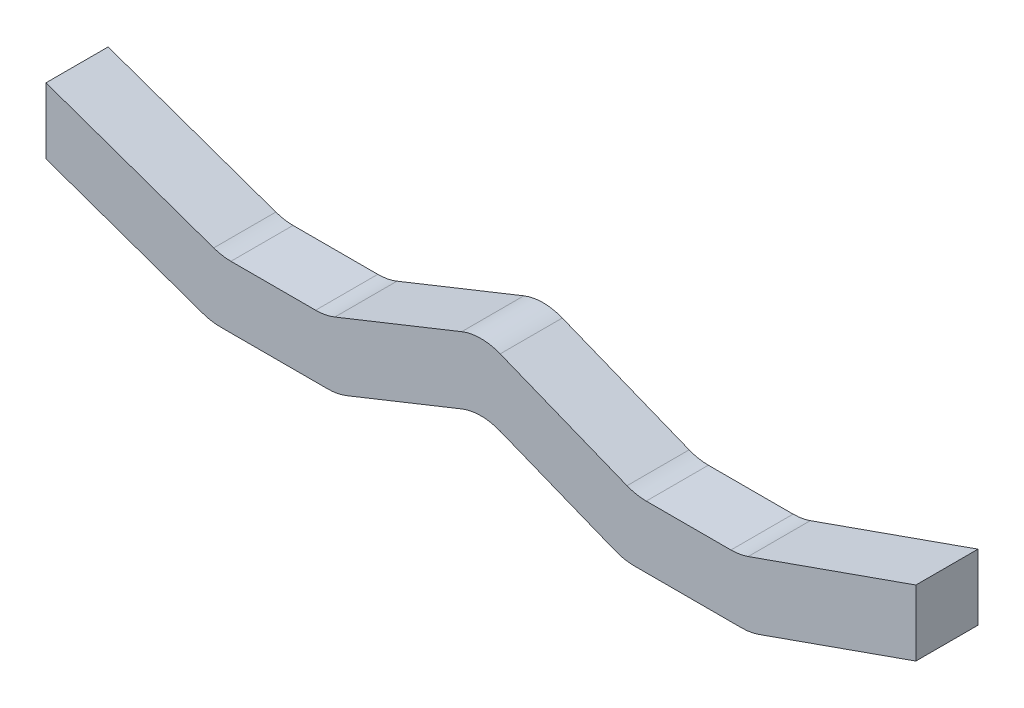
ISO-10303-21;
HEADER;
FILE_DESCRIPTION(('STEP AP214'),'2;1');
FILE_NAME('part.step','',(''),(''),'','','');
FILE_SCHEMA(('AUTOMOTIVE_DESIGN { 1 0 10303 214 1 1 1 1 }'));
ENDSEC;
DATA;
#1=APPLICATION_CONTEXT('core data for automotive mechanical design processes');
#2=APPLICATION_PROTOCOL_DEFINITION('international standard','automotive_design',2000,#1);
#3=PRODUCT_CONTEXT('',#1,'mechanical');
#4=PRODUCT('Part','Part','',(#3));
#5=PRODUCT_RELATED_PRODUCT_CATEGORY('part','',(#4));
#6=PRODUCT_DEFINITION_FORMATION('','',#4);
#7=PRODUCT_DEFINITION_CONTEXT('part definition',#1,'design');
#8=PRODUCT_DEFINITION('design','',#6,#7);
#9=PRODUCT_DEFINITION_SHAPE('','',#8);
#10=(LENGTH_UNIT() NAMED_UNIT(*) SI_UNIT(.MILLI.,.METRE.));
#11=(NAMED_UNIT(*) PLANE_ANGLE_UNIT() SI_UNIT($,.RADIAN.));
#12=(NAMED_UNIT(*) SI_UNIT($,.STERADIAN.) SOLID_ANGLE_UNIT());
#13=UNCERTAINTY_MEASURE_WITH_UNIT(LENGTH_MEASURE(1.E-05),#10,'distance_accuracy_value','');
#14=(GEOMETRIC_REPRESENTATION_CONTEXT(3) GLOBAL_UNCERTAINTY_ASSIGNED_CONTEXT((#13)) GLOBAL_UNIT_ASSIGNED_CONTEXT((#10,
#11,#12)) REPRESENTATION_CONTEXT('',''));
#15=CARTESIAN_POINT('',(0.,0.,0.));
#16=DIRECTION('',(0.,0.,1.));
#17=DIRECTION('',(1.,0.,0.));
#18=AXIS2_PLACEMENT_3D('',#15,#16,#17);
#19=CARTESIAN_POINT('',(0.,0.,19.05));
#20=DIRECTION('',(0.371390676354104,-0.928476690885259,0.));
#21=DIRECTION('',(0.928476690885259,0.371390676354104,0.));
#22=AXIS2_PLACEMENT_3D('',#19,#20,#21);
#23=PLANE('',#22);
#24=DIRECTION('',(-0.928476690885259,-0.371390676354104,0.));
#25=VECTOR('',#24,1.);
#26=CARTESIAN_POINT('',(0.,0.,0.));
#27=LINE('',#26,#25);
#28=CARTESIAN_POINT('',(-5.8958269871214,-2.35833079484856,0.));
#29=VERTEX_POINT('',#28);
#30=CARTESIAN_POINT('',(-44.7864186695088,-17.9145674678035,0.));
#31=VERTEX_POINT('',#30);
#32=EDGE_CURVE('E250',#29,#31,#27,.T.);
#33=ORIENTED_EDGE('',*,*,#32,.T.);
#34=DIRECTION('',(0.,0.,-1.));
#35=VECTOR('',#34,1.);
#36=CARTESIAN_POINT('',(-44.7864186695087,-17.9145674678035,19.05));
#37=LINE('',#36,#35);
#38=CARTESIAN_POINT('',(-44.7864186695088,-17.9145674678035,19.05));
#39=VERTEX_POINT('',#38);
#40=EDGE_CURVE('E358',#31,#39,#37,.F.);
#41=ORIENTED_EDGE('',*,*,#40,.T.);
#42=DIRECTION('',(-0.928476690885259,-0.371390676354104,0.));
#43=VECTOR('',#42,1.);
#44=CARTESIAN_POINT('',(0.,0.,19.05));
#45=LINE('',#44,#43);
#46=CARTESIAN_POINT('',(-5.8958269871214,-2.35833079484856,19.05));
#47=VERTEX_POINT('',#46);
#48=EDGE_CURVE('E286',#47,#39,#45,.T.);
#49=ORIENTED_EDGE('',*,*,#48,.F.);
#50=DIRECTION('',(0.,0.,-1.));
#51=VECTOR('',#50,1.);
#52=CARTESIAN_POINT('',(-5.8958269871214,-2.35833079484856,19.05));
#53=LINE('',#52,#51);
#54=EDGE_CURVE('E355',#47,#29,#53,.T.);
#55=ORIENTED_EDGE('',*,*,#54,.T.);
#56=EDGE_LOOP('',(#33,#41,#49,#55));
#57=FACE_BOUND('',#56,.T.);
#58=ADVANCED_FACE('F33',(#57),#23,.F.);
#59=CARTESIAN_POINT('',(-47.625,-19.05,19.05));
#60=DIRECTION('',(0.,-1.,0.));
#61=DIRECTION('',(1.,0.,0.));
#62=AXIS2_PLACEMENT_3D('',#59,#60,#61);
#63=PLANE('',#62);
#64=DIRECTION('',(-1.,0.,0.));
#65=VECTOR('',#64,1.);
#66=CARTESIAN_POINT('',(-47.625,-19.05,0.));
#67=LINE('',#66,#65);
#68=CARTESIAN_POINT('',(-50.6822456566301,-19.05,0.));
#69=VERTEX_POINT('',#68);
#70=CARTESIAN_POINT('',(-76.6557279183411,-19.05,0.));
#71=VERTEX_POINT('',#70);
#72=EDGE_CURVE('E253',#69,#71,#67,.T.);
#73=ORIENTED_EDGE('',*,*,#72,.T.);
#74=DIRECTION('',(0.,0.,-1.));
#75=VECTOR('',#74,1.);
#76=CARTESIAN_POINT('',(-76.6557279183411,-19.05,19.05));
#77=LINE('',#76,#75);
#78=CARTESIAN_POINT('',(-76.6557279183411,-19.05,19.05));
#79=VERTEX_POINT('',#78);
#80=EDGE_CURVE('E353',#71,#79,#77,.F.);
#81=ORIENTED_EDGE('',*,*,#80,.T.);
#82=DIRECTION('',(-1.,0.,0.));
#83=VECTOR('',#82,1.);
#84=CARTESIAN_POINT('',(-47.625,-19.05,19.05));
#85=LINE('',#84,#83);
#86=CARTESIAN_POINT('',(-50.6822456566301,-19.05,19.05));
#87=VERTEX_POINT('',#86);
#88=EDGE_CURVE('E207',#87,#79,#85,.T.);
#89=ORIENTED_EDGE('',*,*,#88,.F.);
#90=DIRECTION('',(0.,0.,-1.));
#91=VECTOR('',#90,1.);
#92=CARTESIAN_POINT('',(-50.6822456566301,-19.05,0.));
#93=LINE('',#92,#91);
#94=EDGE_CURVE('E350',#87,#69,#93,.T.);
#95=ORIENTED_EDGE('',*,*,#94,.T.);
#96=EDGE_LOOP('',(#73,#81,#89,#95));
#97=FACE_BOUND('',#96,.T.);
#98=ADVANCED_FACE('F389',(#97),#63,.F.);
#99=CARTESIAN_POINT('',(-79.375,-19.05,19.05));
#100=DIRECTION('',(-0.332820117735124,-0.942990333582894,0.));
#101=DIRECTION('',(0.942990333582895,-0.332820117735124,0.));
#102=AXIS2_PLACEMENT_3D('',#99,#100,#101);
#103=PLANE('',#102);
#104=DIRECTION('',(-0.942990333582894,0.332820117735124,0.));
#105=VECTOR('',#104,1.);
#106=CARTESIAN_POINT('',(-79.375,-19.05,19.05));
#107=LINE('',#106,#105);
#108=CARTESIAN_POINT('',(-81.9392472873862,-18.1449715456284,19.05));
#109=VERTEX_POINT('',#108);
#110=CARTESIAN_POINT('',(-133.35,-8.88178419700125E-13,19.05));
#111=VERTEX_POINT('',#110);
#112=EDGE_CURVE('E193',#109,#111,#107,.T.);
#113=ORIENTED_EDGE('',*,*,#112,.F.);
#114=DIRECTION('',(0.,0.,-1.));
#115=VECTOR('',#114,1.);
#116=CARTESIAN_POINT('',(-81.9392472873862,-18.1449715456284,0.));
#117=LINE('',#116,#115);
#118=CARTESIAN_POINT('',(-81.9392472873862,-18.1449715456284,0.));
#119=VERTEX_POINT('',#118);
#120=EDGE_CURVE('E348',#109,#119,#117,.T.);
#121=ORIENTED_EDGE('',*,*,#120,.T.);
#122=DIRECTION('',(-0.942990333582894,0.332820117735124,0.));
#123=VECTOR('',#122,1.);
#124=CARTESIAN_POINT('',(-79.375,-19.05,0.));
#125=LINE('',#124,#123);
#126=CARTESIAN_POINT('',(-133.35,-8.88178419700125E-13,0.));
#127=VERTEX_POINT('',#126);
#128=EDGE_CURVE('E213',#119,#127,#125,.T.);
#129=ORIENTED_EDGE('',*,*,#128,.T.);
#130=DIRECTION('',(0.,0.,-1.));
#131=VECTOR('',#130,1.);
#132=CARTESIAN_POINT('',(-133.35,-8.88178419700125E-13,19.05));
#133=LINE('',#132,#131);
#134=EDGE_CURVE('E210',#111,#127,#133,.T.);
#135=ORIENTED_EDGE('',*,*,#134,.F.);
#136=EDGE_LOOP('',(#113,#121,#129,#135));
#137=FACE_BOUND('',#136,.T.);
#138=ADVANCED_FACE('F211',(#137),#103,.F.);
#139=CARTESIAN_POINT('',(-133.35,-8.88178419700125E-13,19.05));
#140=DIRECTION('',(1.,0.,0.));
#141=DIRECTION('',(0.,0.,-1.));
#142=AXIS2_PLACEMENT_3D('',#139,#140,#141);
#143=PLANE('',#142);
#144=DIRECTION('',(0.,-1.,0.));
#145=VECTOR('',#144,1.);
#146=CARTESIAN_POINT('',(-133.35,-8.88178419700125E-13,0.));
#147=LINE('',#146,#145);
#148=CARTESIAN_POINT('',(-133.35,-20.2016917051732,0.));
#149=VERTEX_POINT('',#148);
#150=EDGE_CURVE('E257',#127,#149,#147,.T.);
#151=ORIENTED_EDGE('',*,*,#150,.T.);
#152=DIRECTION('',(0.,0.,-1.));
#153=VECTOR('',#152,1.);
#154=CARTESIAN_POINT('',(-133.35,-20.2016917051732,19.05));
#155=LINE('',#154,#153);
#156=CARTESIAN_POINT('',(-133.35,-20.2016917051732,19.05));
#157=VERTEX_POINT('',#156);
#158=EDGE_CURVE('E217',#157,#149,#155,.T.);
#159=ORIENTED_EDGE('',*,*,#158,.F.);
#160=DIRECTION('',(0.,-1.,0.));
#161=VECTOR('',#160,1.);
#162=CARTESIAN_POINT('',(-133.35,-8.88178419700125E-13,19.05));
#163=LINE('',#162,#161);
#164=EDGE_CURVE('E199',#111,#157,#163,.T.);
#165=ORIENTED_EDGE('',*,*,#164,.F.);
#166=ORIENTED_EDGE('',*,*,#134,.T.);
#167=EDGE_LOOP('',(#151,#159,#165,#166));
#168=FACE_BOUND('',#167,.T.);
#169=ADVANCED_FACE('F219',(#168),#143,.F.);
#170=CARTESIAN_POINT('',(-133.35,-20.2016917051732,19.05));
#171=DIRECTION('',(0.332820117735138,0.94299033358289,0.));
#172=DIRECTION('',(-0.94299033358289,0.332820117735138,0.));
#173=AXIS2_PLACEMENT_3D('',#170,#171,#172);
#174=PLANE('',#173);
#175=DIRECTION('',(0.942990333582889,-0.332820117735137,0.));
#176=VECTOR('',#175,1.);
#177=CARTESIAN_POINT('',(-133.35,-20.2016917051732,0.));
#178=LINE('',#177,#176);
#179=CARTESIAN_POINT('',(-85.2023737853771,-37.1949715456284,0.));
#180=VERTEX_POINT('',#179);
#181=EDGE_CURVE('E259',#149,#180,#178,.T.);
#182=ORIENTED_EDGE('',*,*,#181,.T.);
#183=DIRECTION('',(0.,0.,-1.));
#184=VECTOR('',#183,1.);
#185=CARTESIAN_POINT('',(-85.2023737853771,-37.1949715456284,19.05));
#186=LINE('',#185,#184);
#187=CARTESIAN_POINT('',(-85.2023737853771,-37.1949715456284,19.05));
#188=VERTEX_POINT('',#187);
#189=EDGE_CURVE('E346',#180,#188,#186,.F.);
#190=ORIENTED_EDGE('',*,*,#189,.T.);
#191=DIRECTION('',(0.942990333582889,-0.332820117735137,0.));
#192=VECTOR('',#191,1.);
#193=CARTESIAN_POINT('',(-133.35,-20.2016917051732,19.05));
#194=LINE('',#193,#192);
#195=EDGE_CURVE('E222',#157,#188,#194,.T.);
#196=ORIENTED_EDGE('',*,*,#195,.F.);
#197=ORIENTED_EDGE('',*,*,#158,.T.);
#198=EDGE_LOOP('',(#182,#190,#196,#197));
#199=FACE_BOUND('',#198,.T.);
#200=ADVANCED_FACE('F396',(#199),#174,.F.);
#201=CARTESIAN_POINT('',(-82.6381264979908,-38.1,19.05));
#202=DIRECTION('',(0.,1.,0.));
#203=DIRECTION('',(-1.,0.,0.));
#204=AXIS2_PLACEMENT_3D('',#201,#202,#203);
#205=PLANE('',#204);
#206=DIRECTION('',(1.,0.,0.));
#207=VECTOR('',#206,1.);
#208=CARTESIAN_POINT('',(-82.6381264979908,-38.1,0.));
#209=LINE('',#208,#207);
#210=CARTESIAN_POINT('',(-79.9188544163318,-38.1,0.));
#211=VERTEX_POINT('',#210);
#212=CARTESIAN_POINT('',(-47.013550868674,-38.1,0.));
#213=VERTEX_POINT('',#212);
#214=EDGE_CURVE('E262',#211,#213,#209,.T.);
#215=ORIENTED_EDGE('',*,*,#214,.T.);
#216=DIRECTION('',(0.,0.,-1.));
#217=VECTOR('',#216,1.);
#218=CARTESIAN_POINT('',(-47.013550868674,-38.1,19.05));
#219=LINE('',#218,#217);
#220=CARTESIAN_POINT('',(-47.013550868674,-38.1,19.05));
#221=VERTEX_POINT('',#220);
#222=EDGE_CURVE('E344',#213,#221,#219,.F.);
#223=ORIENTED_EDGE('',*,*,#222,.T.);
#224=DIRECTION('',(1.,0.,0.));
#225=VECTOR('',#224,1.);
#226=CARTESIAN_POINT('',(-82.6381264979908,-38.1,19.05));
#227=LINE('',#226,#225);
#228=CARTESIAN_POINT('',(-79.9188544163318,-38.1,19.05));
#229=VERTEX_POINT('',#228);
#230=EDGE_CURVE('E224',#229,#221,#227,.T.);
#231=ORIENTED_EDGE('',*,*,#230,.F.);
#232=DIRECTION('',(0.,0.,-1.));
#233=VECTOR('',#232,1.);
#234=CARTESIAN_POINT('',(-79.9188544163318,-38.1,19.05));
#235=LINE('',#234,#233);
#236=EDGE_CURVE('E341',#229,#211,#235,.T.);
#237=ORIENTED_EDGE('',*,*,#236,.T.);
#238=EDGE_LOOP('',(#215,#223,#231,#237));
#239=FACE_BOUND('',#238,.T.);
#240=ADVANCED_FACE('F405',(#239),#205,.F.);
#241=CARTESIAN_POINT('',(-43.9563052120439,-38.1,19.05));
#242=DIRECTION('',(-0.371390676354104,0.928476690885259,0.));
#243=DIRECTION('',(-0.92847669088526,-0.371390676354104,0.));
#244=AXIS2_PLACEMENT_3D('',#241,#242,#243);
#245=PLANE('',#244);
#246=DIRECTION('',(0.928476690885259,0.371390676354104,0.));
#247=VECTOR('',#246,1.);
#248=CARTESIAN_POINT('',(-43.9563052120439,-38.1,0.));
#249=LINE('',#248,#247);
#250=CARTESIAN_POINT('',(-41.1177238815526,-36.9645674678035,0.));
#251=VERTEX_POINT('',#250);
#252=CARTESIAN_POINT('',(-5.8958269871214,-22.875808710031,0.));
#253=VERTEX_POINT('',#252);
#254=EDGE_CURVE('E265',#251,#253,#249,.T.);
#255=ORIENTED_EDGE('',*,*,#254,.T.);
#256=DIRECTION('',(0.,0.,-1.));
#257=VECTOR('',#256,1.);
#258=CARTESIAN_POINT('',(-5.8958269871214,-22.875808710031,19.05));
#259=LINE('',#258,#257);
#260=CARTESIAN_POINT('',(-5.8958269871214,-22.875808710031,19.05));
#261=VERTEX_POINT('',#260);
#262=EDGE_CURVE('E339',#253,#261,#259,.F.);
#263=ORIENTED_EDGE('',*,*,#262,.T.);
#264=DIRECTION('',(0.928476690885259,0.371390676354104,0.));
#265=VECTOR('',#264,1.);
#266=CARTESIAN_POINT('',(-43.9563052120439,-38.1,19.05));
#267=LINE('',#266,#265);
#268=CARTESIAN_POINT('',(-41.1177238815526,-36.9645674678035,19.05));
#269=VERTEX_POINT('',#268);
#270=EDGE_CURVE('E230',#269,#261,#267,.T.);
#271=ORIENTED_EDGE('',*,*,#270,.F.);
#272=DIRECTION('',(0.,0.,-1.));
#273=VECTOR('',#272,1.);
#274=CARTESIAN_POINT('',(-41.1177238815526,-36.9645674678035,19.05));
#275=LINE('',#274,#273);
#276=EDGE_CURVE('E336',#269,#251,#275,.T.);
#277=ORIENTED_EDGE('',*,*,#276,.T.);
#278=EDGE_LOOP('',(#255,#263,#271,#277));
#279=FACE_BOUND('',#278,.T.);
#280=ADVANCED_FACE('F414',(#279),#245,.F.);
#281=CARTESIAN_POINT('',(43.9563052120439,-38.1,19.05));
#282=DIRECTION('',(0.371390676354104,0.928476690885259,0.));
#283=DIRECTION('',(-0.92847669088526,0.371390676354104,0.));
#284=AXIS2_PLACEMENT_3D('',#281,#282,#283);
#285=PLANE('',#284);
#286=DIRECTION('',(0.928476690885259,-0.371390676354104,0.));
#287=VECTOR('',#286,1.);
#288=CARTESIAN_POINT('',(43.9563052120439,-38.1,0.));
#289=LINE('',#288,#287);
#290=CARTESIAN_POINT('',(5.8958269871214,-22.875808710031,0.));
#291=VERTEX_POINT('',#290);
#292=CARTESIAN_POINT('',(41.1177238815526,-36.9645674678035,0.));
#293=VERTEX_POINT('',#292);
#294=EDGE_CURVE('E268',#291,#293,#289,.T.);
#295=ORIENTED_EDGE('',*,*,#294,.T.);
#296=DIRECTION('',(0.,0.,-1.));
#297=VECTOR('',#296,1.);
#298=CARTESIAN_POINT('',(41.1177238815526,-36.9645674678035,19.05));
#299=LINE('',#298,#297);
#300=CARTESIAN_POINT('',(41.1177238815526,-36.9645674678035,19.05));
#301=VERTEX_POINT('',#300);
#302=EDGE_CURVE('E48',#293,#301,#299,.F.);
#303=ORIENTED_EDGE('',*,*,#302,.T.);
#304=DIRECTION('',(0.928476690885259,-0.371390676354104,0.));
#305=VECTOR('',#304,1.);
#306=CARTESIAN_POINT('',(43.9563052120439,-38.1,19.05));
#307=LINE('',#306,#305);
#308=CARTESIAN_POINT('',(5.8958269871214,-22.875808710031,19.05));
#309=VERTEX_POINT('',#308);
#310=EDGE_CURVE('E232',#309,#301,#307,.T.);
#311=ORIENTED_EDGE('',*,*,#310,.F.);
#312=DIRECTION('',(0.,0.,-1.));
#313=VECTOR('',#312,1.);
#314=CARTESIAN_POINT('',(5.8958269871214,-22.875808710031,0.));
#315=LINE('',#314,#313);
#316=EDGE_CURVE('E332',#309,#291,#315,.T.);
#317=ORIENTED_EDGE('',*,*,#316,.T.);
#318=EDGE_LOOP('',(#295,#303,#311,#317));
#319=FACE_BOUND('',#318,.T.);
#320=ADVANCED_FACE('F420',(#319),#285,.F.);
#321=CARTESIAN_POINT('',(82.6381264979908,-38.1,19.05));
#322=DIRECTION('',(0.,1.,0.));
#323=DIRECTION('',(-1.,0.,0.));
#324=AXIS2_PLACEMENT_3D('',#321,#322,#323);
#325=PLANE('',#324);
#326=DIRECTION('',(1.,0.,0.));
#327=VECTOR('',#326,1.);
#328=CARTESIAN_POINT('',(82.6381264979908,-38.1,0.));
#329=LINE('',#328,#327);
#330=CARTESIAN_POINT('',(47.013550868674,-38.1,0.));
#331=VERTEX_POINT('',#330);
#332=CARTESIAN_POINT('',(79.9188544163318,-38.1,0.));
#333=VERTEX_POINT('',#332);
#334=EDGE_CURVE('E270',#331,#333,#329,.T.);
#335=ORIENTED_EDGE('',*,*,#334,.T.);
#336=DIRECTION('',(0.,0.,-1.));
#337=VECTOR('',#336,1.);
#338=CARTESIAN_POINT('',(79.9188544163318,-38.1,19.05));
#339=LINE('',#338,#337);
#340=CARTESIAN_POINT('',(79.9188544163318,-38.1,19.05));
#341=VERTEX_POINT('',#340);
#342=EDGE_CURVE('E320',#333,#341,#339,.F.);
#343=ORIENTED_EDGE('',*,*,#342,.T.);
#344=DIRECTION('',(1.,0.,0.));
#345=VECTOR('',#344,1.);
#346=CARTESIAN_POINT('',(82.6381264979908,-38.1,19.05));
#347=LINE('',#346,#345);
#348=CARTESIAN_POINT('',(47.013550868674,-38.1,19.05));
#349=VERTEX_POINT('',#348);
#350=EDGE_CURVE('E234',#349,#341,#347,.T.);
#351=ORIENTED_EDGE('',*,*,#350,.F.);
#352=DIRECTION('',(0.,0.,-1.));
#353=VECTOR('',#352,1.);
#354=CARTESIAN_POINT('',(47.013550868674,-38.1,19.05));
#355=LINE('',#354,#353);
#356=EDGE_CURVE('E317',#349,#331,#355,.T.);
#357=ORIENTED_EDGE('',*,*,#356,.T.);
#358=EDGE_LOOP('',(#335,#343,#351,#357));
#359=FACE_BOUND('',#358,.T.);
#360=ADVANCED_FACE('F428',(#359),#325,.F.);
#361=CARTESIAN_POINT('',(133.35,-20.2016917051732,19.05));
#362=DIRECTION('',(-0.332820117735138,0.94299033358289,0.));
#363=DIRECTION('',(-0.94299033358289,-0.332820117735138,0.));
#364=AXIS2_PLACEMENT_3D('',#361,#362,#363);
#365=PLANE('',#364);
#366=DIRECTION('',(0.942990333582889,0.332820117735137,0.));
#367=VECTOR('',#366,1.);
#368=CARTESIAN_POINT('',(133.35,-20.2016917051732,19.05));
#369=LINE('',#368,#367);
#370=CARTESIAN_POINT('',(85.2023737853771,-37.1949715456284,19.05));
#371=VERTEX_POINT('',#370);
#372=CARTESIAN_POINT('',(133.35,-20.2016917051732,19.05));
#373=VERTEX_POINT('',#372);
#374=EDGE_CURVE('E236',#371,#373,#369,.T.);
#375=ORIENTED_EDGE('',*,*,#374,.F.);
#376=DIRECTION('',(0.,0.,-1.));
#377=VECTOR('',#376,1.);
#378=CARTESIAN_POINT('',(85.2023737853771,-37.1949715456284,19.05));
#379=LINE('',#378,#377);
#380=CARTESIAN_POINT('',(85.2023737853771,-37.1949715456284,0.));
#381=VERTEX_POINT('',#380);
#382=EDGE_CURVE('E304',#371,#381,#379,.T.);
#383=ORIENTED_EDGE('',*,*,#382,.T.);
#384=DIRECTION('',(0.942990333582889,0.332820117735137,0.));
#385=VECTOR('',#384,1.);
#386=CARTESIAN_POINT('',(133.35,-20.2016917051732,0.));
#387=LINE('',#386,#385);
#388=CARTESIAN_POINT('',(133.35,-20.2016917051732,0.));
#389=VERTEX_POINT('',#388);
#390=EDGE_CURVE('E273',#381,#389,#387,.T.);
#391=ORIENTED_EDGE('',*,*,#390,.T.);
#392=DIRECTION('',(0.,0.,-1.));
#393=VECTOR('',#392,1.);
#394=CARTESIAN_POINT('',(133.35,-20.2016917051732,19.05));
#395=LINE('',#394,#393);
#396=EDGE_CURVE('E289',#373,#389,#395,.T.);
#397=ORIENTED_EDGE('',*,*,#396,.F.);
#398=EDGE_LOOP('',(#375,#383,#391,#397));
#399=FACE_BOUND('',#398,.T.);
#400=ADVANCED_FACE('F436',(#399),#365,.F.);
#401=CARTESIAN_POINT('',(133.35,0.,19.05));
#402=DIRECTION('',(-1.,0.,0.));
#403=DIRECTION('',(0.,0.,1.));
#404=AXIS2_PLACEMENT_3D('',#401,#402,#403);
#405=PLANE('',#404);
#406=DIRECTION('',(0.,1.,0.));
#407=VECTOR('',#406,1.);
#408=CARTESIAN_POINT('',(133.35,0.,0.));
#409=LINE('',#408,#407);
#410=CARTESIAN_POINT('',(133.35,0.,0.));
#411=VERTEX_POINT('',#410);
#412=EDGE_CURVE('E275',#389,#411,#409,.T.);
#413=ORIENTED_EDGE('',*,*,#412,.T.);
#414=DIRECTION('',(0.,0.,-1.));
#415=VECTOR('',#414,1.);
#416=CARTESIAN_POINT('',(133.35,0.,19.05));
#417=LINE('',#416,#415);
#418=CARTESIAN_POINT('',(133.35,0.,19.05));
#419=VERTEX_POINT('',#418);
#420=EDGE_CURVE('E249',#419,#411,#417,.T.);
#421=ORIENTED_EDGE('',*,*,#420,.F.);
#422=DIRECTION('',(0.,1.,0.));
#423=VECTOR('',#422,1.);
#424=CARTESIAN_POINT('',(133.35,0.,19.05));
#425=LINE('',#424,#423);
#426=EDGE_CURVE('E238',#373,#419,#425,.T.);
#427=ORIENTED_EDGE('',*,*,#426,.F.);
#428=ORIENTED_EDGE('',*,*,#396,.T.);
#429=EDGE_LOOP('',(#413,#421,#427,#428));
#430=FACE_BOUND('',#429,.T.);
#431=ADVANCED_FACE('F442',(#430),#405,.F.);
#432=CARTESIAN_POINT('',(79.375,-19.05,19.05));
#433=DIRECTION('',(0.332820117735137,-0.94299033358289,0.));
#434=DIRECTION('',(0.94299033358289,0.332820117735137,0.));
#435=AXIS2_PLACEMENT_3D('',#432,#433,#434);
#436=PLANE('',#435);
#437=DIRECTION('',(-0.942990333582889,-0.332820117735137,0.));
#438=VECTOR('',#437,1.);
#439=CARTESIAN_POINT('',(79.375,-19.05,0.));
#440=LINE('',#439,#438);
#441=CARTESIAN_POINT('',(81.9392472873863,-18.1449715456284,0.));
#442=VERTEX_POINT('',#441);
#443=EDGE_CURVE('E277',#411,#442,#440,.T.);
#444=ORIENTED_EDGE('',*,*,#443,.T.);
#445=DIRECTION('',(0.,0.,-1.));
#446=VECTOR('',#445,1.);
#447=CARTESIAN_POINT('',(81.9392472873863,-18.1449715456284,19.05));
#448=LINE('',#447,#446);
#449=CARTESIAN_POINT('',(81.9392472873863,-18.1449715456284,19.05));
#450=VERTEX_POINT('',#449);
#451=EDGE_CURVE('E297',#442,#450,#448,.F.);
#452=ORIENTED_EDGE('',*,*,#451,.T.);
#453=DIRECTION('',(-0.942990333582889,-0.332820117735137,0.));
#454=VECTOR('',#453,1.);
#455=CARTESIAN_POINT('',(79.375,-19.05,19.05));
#456=LINE('',#455,#454);
#457=EDGE_CURVE('E240',#419,#450,#456,.T.);
#458=ORIENTED_EDGE('',*,*,#457,.F.);
#459=ORIENTED_EDGE('',*,*,#420,.T.);
#460=EDGE_LOOP('',(#444,#452,#458,#459));
#461=FACE_BOUND('',#460,.T.);
#462=ADVANCED_FACE('F446',(#461),#436,.F.);
#463=CARTESIAN_POINT('',(47.625,-19.05,19.05));
#464=DIRECTION('',(0.,-1.,0.));
#465=DIRECTION('',(1.,0.,0.));
#466=AXIS2_PLACEMENT_3D('',#463,#464,#465);
#467=PLANE('',#466);
#468=DIRECTION('',(-1.,0.,0.));
#469=VECTOR('',#468,1.);
#470=CARTESIAN_POINT('',(47.625,-19.05,19.05));
#471=LINE('',#470,#469);
#472=CARTESIAN_POINT('',(76.655727918341,-19.05,19.05));
#473=VERTEX_POINT('',#472);
#474=CARTESIAN_POINT('',(50.6822456566301,-19.05,19.05));
#475=VERTEX_POINT('',#474);
#476=EDGE_CURVE('E243',#473,#475,#471,.T.);
#477=ORIENTED_EDGE('',*,*,#476,.F.);
#478=DIRECTION('',(0.,0.,-1.));
#479=VECTOR('',#478,1.);
#480=CARTESIAN_POINT('',(76.655727918341,-19.05,0.));
#481=LINE('',#480,#479);
#482=CARTESIAN_POINT('',(76.655727918341,-19.05,0.));
#483=VERTEX_POINT('',#482);
#484=EDGE_CURVE('E294',#473,#483,#481,.T.);
#485=ORIENTED_EDGE('',*,*,#484,.T.);
#486=DIRECTION('',(-1.,0.,0.));
#487=VECTOR('',#486,1.);
#488=CARTESIAN_POINT('',(47.625,-19.05,0.));
#489=LINE('',#488,#487);
#490=CARTESIAN_POINT('',(50.6822456566301,-19.05,0.));
#491=VERTEX_POINT('',#490);
#492=EDGE_CURVE('E280',#483,#491,#489,.T.);
#493=ORIENTED_EDGE('',*,*,#492,.T.);
#494=DIRECTION('',(0.,0.,-1.));
#495=VECTOR('',#494,1.);
#496=CARTESIAN_POINT('',(50.6822456566301,-19.05,19.05));
#497=LINE('',#496,#495);
#498=EDGE_CURVE('E216',#491,#475,#497,.F.);
#499=ORIENTED_EDGE('',*,*,#498,.T.);
#500=EDGE_LOOP('',(#477,#485,#493,#499));
#501=FACE_BOUND('',#500,.T.);
#502=ADVANCED_FACE('F455',(#501),#467,.F.);
#503=CARTESIAN_POINT('',(0.,0.,19.05));
#504=DIRECTION('',(-0.371390676354104,-0.928476690885259,0.));
#505=DIRECTION('',(0.928476690885259,-0.371390676354104,0.));
#506=AXIS2_PLACEMENT_3D('',#503,#504,#505);
#507=PLANE('',#506);
#508=DIRECTION('',(-0.928476690885259,0.371390676354104,0.));
#509=VECTOR('',#508,1.);
#510=CARTESIAN_POINT('',(0.,0.,19.05));
#511=LINE('',#510,#509);
#512=CARTESIAN_POINT('',(44.7864186695087,-17.9145674678035,19.05));
#513=VERTEX_POINT('',#512);
#514=CARTESIAN_POINT('',(5.8958269871214,-2.35833079484856,19.05));
#515=VERTEX_POINT('',#514);
#516=EDGE_CURVE('E246',#513,#515,#511,.T.);
#517=ORIENTED_EDGE('',*,*,#516,.F.);
#518=DIRECTION('',(0.,0.,-1.));
#519=VECTOR('',#518,1.);
#520=CARTESIAN_POINT('',(44.7864186695087,-17.9145674678035,0.));
#521=LINE('',#520,#519);
#522=CARTESIAN_POINT('',(44.7864186695087,-17.9145674678035,0.));
#523=VERTEX_POINT('',#522);
#524=EDGE_CURVE('E301',#513,#523,#521,.T.);
#525=ORIENTED_EDGE('',*,*,#524,.T.);
#526=DIRECTION('',(-0.928476690885259,0.371390676354104,0.));
#527=VECTOR('',#526,1.);
#528=CARTESIAN_POINT('',(0.,0.,0.));
#529=LINE('',#528,#527);
#530=CARTESIAN_POINT('',(5.8958269871214,-2.35833079484856,0.));
#531=VERTEX_POINT('',#530);
#532=EDGE_CURVE('E283',#523,#531,#529,.T.);
#533=ORIENTED_EDGE('',*,*,#532,.T.);
#534=DIRECTION('',(0.,0.,-1.));
#535=VECTOR('',#534,1.);
#536=CARTESIAN_POINT('',(5.8958269871214,-2.35833079484856,19.05));
#537=LINE('',#536,#535);
#538=EDGE_CURVE('E299',#531,#515,#537,.F.);
#539=ORIENTED_EDGE('',*,*,#538,.T.);
#540=EDGE_LOOP('',(#517,#525,#533,#539));
#541=FACE_BOUND('',#540,.T.);
#542=ADVANCED_FACE('F464',(#541),#507,.F.);
#543=CARTESIAN_POINT('',(0.,0.,19.05));
#544=DIRECTION('',(0.,0.,1.));
#545=DIRECTION('',(1.,0.,0.));
#546=AXIS2_PLACEMENT_3D('',#543,#544,#545);
#547=PLANE('',#546);
#548=ORIENTED_EDGE('',*,*,#350,.T.);
#549=CARTESIAN_POINT('',(79.9188544163318,-22.225,19.05));
#550=DIRECTION('',(0.,0.,1.));
#551=DIRECTION('',(1.,0.,0.));
#552=AXIS2_PLACEMENT_3D('',#549,#550,#551);
#553=CIRCLE('',#552,15.875);
#554=EDGE_CURVE('E330',#341,#371,#553,.T.);
#555=ORIENTED_EDGE('',*,*,#554,.T.);
#556=ORIENTED_EDGE('',*,*,#374,.T.);
#557=ORIENTED_EDGE('',*,*,#426,.T.);
#558=ORIENTED_EDGE('',*,*,#457,.T.);
#559=CARTESIAN_POINT('',(76.655727918341,-3.175,19.05));
#560=DIRECTION('',(0.,0.,1.));
#561=DIRECTION('',(1.,0.,0.));
#562=AXIS2_PLACEMENT_3D('',#559,#560,#561);
#563=CIRCLE('',#562,15.875);
#564=EDGE_CURVE('E362',#450,#473,#563,.F.);
#565=ORIENTED_EDGE('',*,*,#564,.T.);
#566=ORIENTED_EDGE('',*,*,#476,.T.);
#567=CARTESIAN_POINT('',(50.6822456566301,-3.175,19.05));
#568=DIRECTION('',(0.,0.,1.));
#569=DIRECTION('',(1.,0.,0.));
#570=AXIS2_PLACEMENT_3D('',#567,#568,#569);
#571=CIRCLE('',#570,15.875);
#572=EDGE_CURVE('E366',#475,#513,#571,.F.);
#573=ORIENTED_EDGE('',*,*,#572,.T.);
#574=ORIENTED_EDGE('',*,*,#516,.T.);
#575=CARTESIAN_POINT('',(0.,-17.097898262652,19.05));
#576=DIRECTION('',(0.,0.,1.));
#577=DIRECTION('',(1.,0.,0.));
#578=AXIS2_PLACEMENT_3D('',#575,#576,#577);
#579=CIRCLE('',#578,15.875);
#580=EDGE_CURVE('E322',#515,#47,#579,.T.);
#581=ORIENTED_EDGE('',*,*,#580,.T.);
#582=ORIENTED_EDGE('',*,*,#48,.T.);
#583=CARTESIAN_POINT('',(-50.6822456566301,-3.175,19.05));
#584=DIRECTION('',(0.,0.,1.));
#585=DIRECTION('',(1.,0.,0.));
#586=AXIS2_PLACEMENT_3D('',#583,#584,#585);
#587=CIRCLE('',#586,15.875);
#588=EDGE_CURVE('E11',#39,#87,#587,.F.);
#589=ORIENTED_EDGE('',*,*,#588,.T.);
#590=ORIENTED_EDGE('',*,*,#88,.T.);
#591=CARTESIAN_POINT('',(-76.6557279183411,-3.175,19.05));
#592=DIRECTION('',(0.,0.,1.));
#593=DIRECTION('',(1.,0.,0.));
#594=AXIS2_PLACEMENT_3D('',#591,#592,#593);
#595=CIRCLE('',#594,15.875);
#596=EDGE_CURVE('E203',#79,#109,#595,.F.);
#597=ORIENTED_EDGE('',*,*,#596,.T.);
#598=ORIENTED_EDGE('',*,*,#112,.T.);
#599=ORIENTED_EDGE('',*,*,#164,.T.);
#600=ORIENTED_EDGE('',*,*,#195,.T.);
#601=CARTESIAN_POINT('',(-79.9188544163318,-22.225,19.05));
#602=DIRECTION('',(0.,0.,1.));
#603=DIRECTION('',(1.,0.,0.));
#604=AXIS2_PLACEMENT_3D('',#601,#602,#603);
#605=CIRCLE('',#604,15.875);
#606=EDGE_CURVE('E324',#188,#229,#605,.T.);
#607=ORIENTED_EDGE('',*,*,#606,.T.);
#608=ORIENTED_EDGE('',*,*,#230,.T.);
#609=CARTESIAN_POINT('',(-47.013550868674,-22.225,19.05));
#610=DIRECTION('',(0.,0.,1.));
#611=DIRECTION('',(1.,0.,0.));
#612=AXIS2_PLACEMENT_3D('',#609,#610,#611);
#613=CIRCLE('',#612,15.875);
#614=EDGE_CURVE('E326',#221,#269,#613,.T.);
#615=ORIENTED_EDGE('',*,*,#614,.T.);
#616=ORIENTED_EDGE('',*,*,#270,.T.);
#617=CARTESIAN_POINT('',(0.,-37.6153761778345,19.05));
#618=DIRECTION('',(0.,0.,1.));
#619=DIRECTION('',(1.,0.,0.));
#620=AXIS2_PLACEMENT_3D('',#617,#618,#619);
#621=CIRCLE('',#620,15.875);
#622=EDGE_CURVE('E55',#261,#309,#621,.F.);
#623=ORIENTED_EDGE('',*,*,#622,.T.);
#624=ORIENTED_EDGE('',*,*,#310,.T.);
#625=CARTESIAN_POINT('',(47.013550868674,-22.225,19.05));
#626=DIRECTION('',(0.,0.,1.));
#627=DIRECTION('',(1.,0.,0.));
#628=AXIS2_PLACEMENT_3D('',#625,#626,#627);
#629=CIRCLE('',#628,15.875);
#630=EDGE_CURVE('E328',#301,#349,#629,.T.);
#631=ORIENTED_EDGE('',*,*,#630,.T.);
#632=EDGE_LOOP('',(#548,#555,#556,#557,#558,#565,#566,#573,#574,#581,#582,#589,#590,#597,#598,
#599,#600,#607,#608,#615,#616,#623,#624,#631));
#633=FACE_BOUND('',#632,.T.);
#634=ADVANCED_FACE('F196',(#633),#547,.T.);
#635=CARTESIAN_POINT('',(0.,0.,0.));
#636=DIRECTION('',(0.,0.,1.));
#637=DIRECTION('',(1.,0.,0.));
#638=AXIS2_PLACEMENT_3D('',#635,#636,#637);
#639=PLANE('',#638);
#640=ORIENTED_EDGE('',*,*,#390,.F.);
#641=CARTESIAN_POINT('',(79.9188544163318,-22.225,0.));
#642=DIRECTION('',(0.,0.,1.));
#643=DIRECTION('',(1.,0.,0.));
#644=AXIS2_PLACEMENT_3D('',#641,#642,#643);
#645=CIRCLE('',#644,15.875);
#646=EDGE_CURVE('E315',#381,#333,#645,.F.);
#647=ORIENTED_EDGE('',*,*,#646,.T.);
#648=ORIENTED_EDGE('',*,*,#334,.F.);
#649=CARTESIAN_POINT('',(47.013550868674,-22.225,0.));
#650=DIRECTION('',(0.,0.,1.));
#651=DIRECTION('',(1.,0.,0.));
#652=AXIS2_PLACEMENT_3D('',#649,#650,#651);
#653=CIRCLE('',#652,15.875);
#654=EDGE_CURVE('E313',#331,#293,#653,.F.);
#655=ORIENTED_EDGE('',*,*,#654,.T.);
#656=ORIENTED_EDGE('',*,*,#294,.F.);
#657=CARTESIAN_POINT('',(0.,-37.6153761778345,0.));
#658=DIRECTION('',(0.,0.,1.));
#659=DIRECTION('',(1.,0.,0.));
#660=AXIS2_PLACEMENT_3D('',#657,#658,#659);
#661=CIRCLE('',#660,15.875);
#662=EDGE_CURVE('E368',#291,#253,#661,.T.);
#663=ORIENTED_EDGE('',*,*,#662,.T.);
#664=ORIENTED_EDGE('',*,*,#254,.F.);
#665=CARTESIAN_POINT('',(-47.013550868674,-22.225,0.));
#666=DIRECTION('',(0.,0.,1.));
#667=DIRECTION('',(1.,0.,0.));
#668=AXIS2_PLACEMENT_3D('',#665,#666,#667);
#669=CIRCLE('',#668,15.875);
#670=EDGE_CURVE('E311',#251,#213,#669,.F.);
#671=ORIENTED_EDGE('',*,*,#670,.T.);
#672=ORIENTED_EDGE('',*,*,#214,.F.);
#673=CARTESIAN_POINT('',(-79.9188544163318,-22.225,0.));
#674=DIRECTION('',(0.,0.,1.));
#675=DIRECTION('',(1.,0.,0.));
#676=AXIS2_PLACEMENT_3D('',#673,#674,#675);
#677=CIRCLE('',#676,15.875);
#678=EDGE_CURVE('E309',#211,#180,#677,.F.);
#679=ORIENTED_EDGE('',*,*,#678,.T.);
#680=ORIENTED_EDGE('',*,*,#181,.F.);
#681=ORIENTED_EDGE('',*,*,#150,.F.);
#682=ORIENTED_EDGE('',*,*,#128,.F.);
#683=CARTESIAN_POINT('',(-76.6557279183411,-3.175,0.));
#684=DIRECTION('',(0.,0.,1.));
#685=DIRECTION('',(1.,0.,0.));
#686=AXIS2_PLACEMENT_3D('',#683,#684,#685);
#687=CIRCLE('',#686,15.875);
#688=EDGE_CURVE('E371',#119,#71,#687,.T.);
#689=ORIENTED_EDGE('',*,*,#688,.T.);
#690=ORIENTED_EDGE('',*,*,#72,.F.);
#691=CARTESIAN_POINT('',(-50.6822456566301,-3.175,0.));
#692=DIRECTION('',(0.,0.,1.));
#693=DIRECTION('',(1.,0.,0.));
#694=AXIS2_PLACEMENT_3D('',#691,#692,#693);
#695=CIRCLE('',#694,15.875);
#696=EDGE_CURVE('E41',#69,#31,#695,.T.);
#697=ORIENTED_EDGE('',*,*,#696,.T.);
#698=ORIENTED_EDGE('',*,*,#32,.F.);
#699=CARTESIAN_POINT('',(0.,-17.097898262652,0.));
#700=DIRECTION('',(0.,0.,1.));
#701=DIRECTION('',(1.,0.,0.));
#702=AXIS2_PLACEMENT_3D('',#699,#700,#701);
#703=CIRCLE('',#702,15.875);
#704=EDGE_CURVE('E307',#29,#531,#703,.F.);
#705=ORIENTED_EDGE('',*,*,#704,.T.);
#706=ORIENTED_EDGE('',*,*,#532,.F.);
#707=CARTESIAN_POINT('',(50.6822456566301,-3.175,0.));
#708=DIRECTION('',(0.,0.,1.));
#709=DIRECTION('',(1.,0.,0.));
#710=AXIS2_PLACEMENT_3D('',#707,#708,#709);
#711=CIRCLE('',#710,15.875);
#712=EDGE_CURVE('E364',#523,#491,#711,.T.);
#713=ORIENTED_EDGE('',*,*,#712,.T.);
#714=ORIENTED_EDGE('',*,*,#492,.F.);
#715=CARTESIAN_POINT('',(76.655727918341,-3.175,0.));
#716=DIRECTION('',(0.,0.,1.));
#717=DIRECTION('',(1.,0.,0.));
#718=AXIS2_PLACEMENT_3D('',#715,#716,#717);
#719=CIRCLE('',#718,15.875);
#720=EDGE_CURVE('E360',#483,#442,#719,.T.);
#721=ORIENTED_EDGE('',*,*,#720,.T.);
#722=ORIENTED_EDGE('',*,*,#443,.F.);
#723=ORIENTED_EDGE('',*,*,#412,.F.);
#724=EDGE_LOOP('',(#640,#647,#648,#655,#656,#663,#664,#671,#672,#679,#680,#681,#682,#689,#690,
#697,#698,#705,#706,#713,#714,#721,#722,#723));
#725=FACE_BOUND('',#724,.T.);
#726=ADVANCED_FACE('F377',(#725),#639,.F.);
#727=CARTESIAN_POINT('',(76.655727918341,-3.175,19.05));
#728=DIRECTION('',(0.,0.,1.));
#729=DIRECTION('',(1.,0.,0.));
#730=AXIS2_PLACEMENT_3D('',#727,#728,#729);
#731=CYLINDRICAL_SURFACE('',#730,15.875);
#732=ORIENTED_EDGE('',*,*,#564,.F.);
#733=ORIENTED_EDGE('',*,*,#451,.F.);
#734=ORIENTED_EDGE('',*,*,#720,.F.);
#735=ORIENTED_EDGE('',*,*,#484,.F.);
#736=EDGE_LOOP('',(#732,#733,#734,#735));
#737=FACE_BOUND('',#736,.T.);
#738=ADVANCED_FACE('F452',(#737),#731,.F.);
#739=CARTESIAN_POINT('',(50.6822456566301,-3.175,19.05));
#740=DIRECTION('',(0.,0.,1.));
#741=DIRECTION('',(1.,0.,0.));
#742=AXIS2_PLACEMENT_3D('',#739,#740,#741);
#743=CYLINDRICAL_SURFACE('',#742,15.875);
#744=ORIENTED_EDGE('',*,*,#572,.F.);
#745=ORIENTED_EDGE('',*,*,#498,.F.);
#746=ORIENTED_EDGE('',*,*,#712,.F.);
#747=ORIENTED_EDGE('',*,*,#524,.F.);
#748=EDGE_LOOP('',(#744,#745,#746,#747));
#749=FACE_BOUND('',#748,.T.);
#750=ADVANCED_FACE('F461',(#749),#743,.F.);
#751=CARTESIAN_POINT('',(79.9188544163318,-22.225,19.05));
#752=DIRECTION('',(0.,0.,-1.));
#753=DIRECTION('',(-1.,0.,0.));
#754=AXIS2_PLACEMENT_3D('',#751,#752,#753);
#755=CYLINDRICAL_SURFACE('',#754,15.875);
#756=ORIENTED_EDGE('',*,*,#554,.F.);
#757=ORIENTED_EDGE('',*,*,#342,.F.);
#758=ORIENTED_EDGE('',*,*,#646,.F.);
#759=ORIENTED_EDGE('',*,*,#382,.F.);
#760=EDGE_LOOP('',(#756,#757,#758,#759));
#761=FACE_BOUND('',#760,.T.);
#762=ADVANCED_FACE('F434',(#761),#755,.T.);
#763=CARTESIAN_POINT('',(47.013550868674,-22.225,19.05));
#764=DIRECTION('',(0.,0.,-1.));
#765=DIRECTION('',(-1.,0.,0.));
#766=AXIS2_PLACEMENT_3D('',#763,#764,#765);
#767=CYLINDRICAL_SURFACE('',#766,15.875);
#768=ORIENTED_EDGE('',*,*,#630,.F.);
#769=ORIENTED_EDGE('',*,*,#302,.F.);
#770=ORIENTED_EDGE('',*,*,#654,.F.);
#771=ORIENTED_EDGE('',*,*,#356,.F.);
#772=EDGE_LOOP('',(#768,#769,#770,#771));
#773=FACE_BOUND('',#772,.T.);
#774=ADVANCED_FACE('F425',(#773),#767,.T.);
#775=CARTESIAN_POINT('',(0.,-37.6153761778345,19.05));
#776=DIRECTION('',(0.,0.,1.));
#777=DIRECTION('',(1.,0.,0.));
#778=AXIS2_PLACEMENT_3D('',#775,#776,#777);
#779=CYLINDRICAL_SURFACE('',#778,15.875);
#780=ORIENTED_EDGE('',*,*,#622,.F.);
#781=ORIENTED_EDGE('',*,*,#262,.F.);
#782=ORIENTED_EDGE('',*,*,#662,.F.);
#783=ORIENTED_EDGE('',*,*,#316,.F.);
#784=EDGE_LOOP('',(#780,#781,#782,#783));
#785=FACE_BOUND('',#784,.T.);
#786=ADVANCED_FACE('F418',(#785),#779,.F.);
#787=CARTESIAN_POINT('',(-47.013550868674,-22.225,19.05));
#788=DIRECTION('',(0.,0.,-1.));
#789=DIRECTION('',(-1.,0.,0.));
#790=AXIS2_PLACEMENT_3D('',#787,#788,#789);
#791=CYLINDRICAL_SURFACE('',#790,15.875);
#792=ORIENTED_EDGE('',*,*,#614,.F.);
#793=ORIENTED_EDGE('',*,*,#222,.F.);
#794=ORIENTED_EDGE('',*,*,#670,.F.);
#795=ORIENTED_EDGE('',*,*,#276,.F.);
#796=EDGE_LOOP('',(#792,#793,#794,#795));
#797=FACE_BOUND('',#796,.T.);
#798=ADVANCED_FACE('F411',(#797),#791,.T.);
#799=CARTESIAN_POINT('',(-79.9188544163318,-22.225,19.05));
#800=DIRECTION('',(0.,0.,-1.));
#801=DIRECTION('',(-1.,0.,0.));
#802=AXIS2_PLACEMENT_3D('',#799,#800,#801);
#803=CYLINDRICAL_SURFACE('',#802,15.875);
#804=ORIENTED_EDGE('',*,*,#606,.F.);
#805=ORIENTED_EDGE('',*,*,#189,.F.);
#806=ORIENTED_EDGE('',*,*,#678,.F.);
#807=ORIENTED_EDGE('',*,*,#236,.F.);
#808=EDGE_LOOP('',(#804,#805,#806,#807));
#809=FACE_BOUND('',#808,.T.);
#810=ADVANCED_FACE('F402',(#809),#803,.T.);
#811=CARTESIAN_POINT('',(-76.6557279183411,-3.175,19.05));
#812=DIRECTION('',(0.,0.,1.));
#813=DIRECTION('',(1.,0.,0.));
#814=AXIS2_PLACEMENT_3D('',#811,#812,#813);
#815=CYLINDRICAL_SURFACE('',#814,15.875);
#816=ORIENTED_EDGE('',*,*,#596,.F.);
#817=ORIENTED_EDGE('',*,*,#80,.F.);
#818=ORIENTED_EDGE('',*,*,#688,.F.);
#819=ORIENTED_EDGE('',*,*,#120,.F.);
#820=EDGE_LOOP('',(#816,#817,#818,#819));
#821=FACE_BOUND('',#820,.T.);
#822=ADVANCED_FACE('F393',(#821),#815,.F.);
#823=CARTESIAN_POINT('',(-50.6822456566301,-3.175,19.05));
#824=DIRECTION('',(0.,0.,1.));
#825=DIRECTION('',(1.,0.,0.));
#826=AXIS2_PLACEMENT_3D('',#823,#824,#825);
#827=CYLINDRICAL_SURFACE('',#826,15.875);
#828=ORIENTED_EDGE('',*,*,#588,.F.);
#829=ORIENTED_EDGE('',*,*,#40,.F.);
#830=ORIENTED_EDGE('',*,*,#696,.F.);
#831=ORIENTED_EDGE('',*,*,#94,.F.);
#832=EDGE_LOOP('',(#828,#829,#830,#831));
#833=FACE_BOUND('',#832,.T.);
#834=ADVANCED_FACE('F386',(#833),#827,.F.);
#835=CARTESIAN_POINT('',(0.,-17.097898262652,19.05));
#836=DIRECTION('',(0.,0.,-1.));
#837=DIRECTION('',(-1.,0.,0.));
#838=AXIS2_PLACEMENT_3D('',#835,#836,#837);
#839=CYLINDRICAL_SURFACE('',#838,15.875);
#840=ORIENTED_EDGE('',*,*,#580,.F.);
#841=ORIENTED_EDGE('',*,*,#538,.F.);
#842=ORIENTED_EDGE('',*,*,#704,.F.);
#843=ORIENTED_EDGE('',*,*,#54,.F.);
#844=EDGE_LOOP('',(#840,#841,#842,#843));
#845=FACE_BOUND('',#844,.T.);
#846=ADVANCED_FACE('F35',(#845),#839,.T.);
#847=CLOSED_SHELL('',(#58,#98,#138,#169,#200,#240,#280,#320,#360,#400,#431,#462,#502,#542,#634,
#726,#738,#750,#762,#774,#786,#798,#810,#822,#834,#846));
#848=MANIFOLD_SOLID_BREP('B2',#847);
#849=ADVANCED_BREP_SHAPE_REPRESENTATION('',(#18,#848),#14);
#850=SHAPE_DEFINITION_REPRESENTATION(#9,#849);
ENDSEC;
END-ISO-10303-21;
